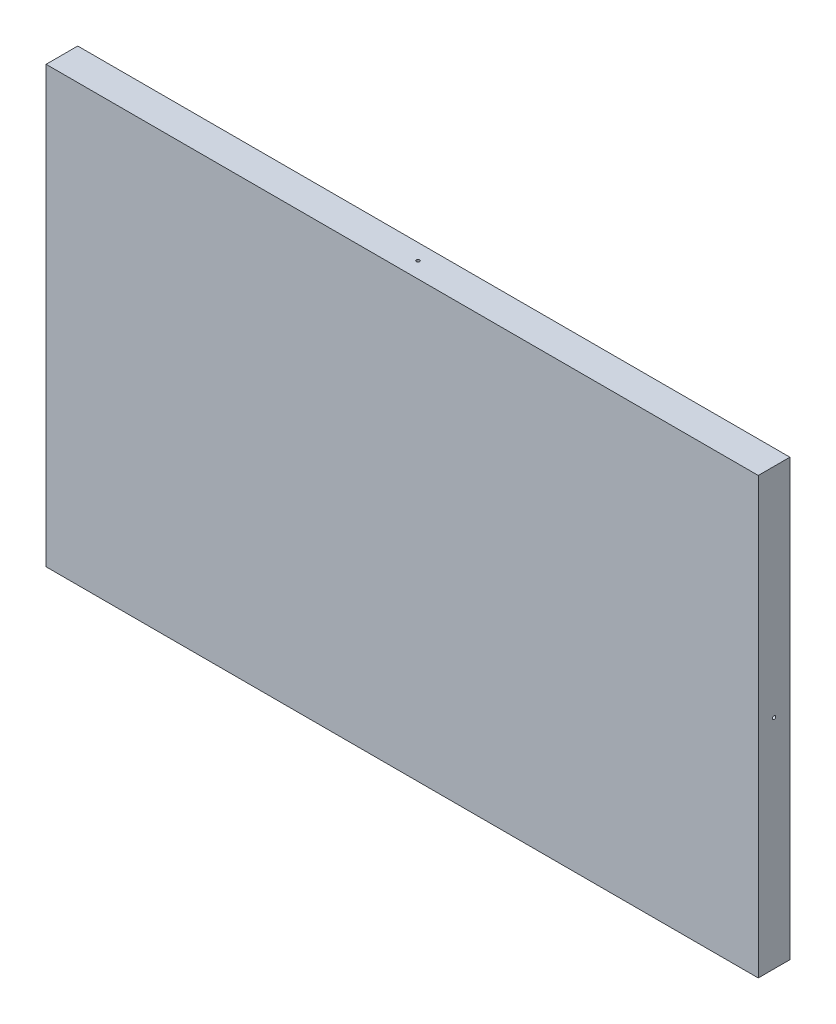
ISO-10303-21;
HEADER;
FILE_DESCRIPTION(('STEP AP214'),'2;1');
FILE_NAME('part.step','',(''),(''),'','','');
FILE_SCHEMA(('AUTOMOTIVE_DESIGN { 1 0 10303 214 1 1 1 1 }'));
ENDSEC;
DATA;
#1=APPLICATION_CONTEXT('core data for automotive mechanical design processes');
#2=APPLICATION_PROTOCOL_DEFINITION('international standard','automotive_design',2000,#1);
#3=PRODUCT_CONTEXT('',#1,'mechanical');
#4=PRODUCT('Part','Part','',(#3));
#5=PRODUCT_RELATED_PRODUCT_CATEGORY('part','',(#4));
#6=PRODUCT_DEFINITION_FORMATION('','',#4);
#7=PRODUCT_DEFINITION_CONTEXT('part definition',#1,'design');
#8=PRODUCT_DEFINITION('design','',#6,#7);
#9=PRODUCT_DEFINITION_SHAPE('','',#8);
#10=(LENGTH_UNIT() NAMED_UNIT(*) SI_UNIT(.MILLI.,.METRE.));
#11=(NAMED_UNIT(*) PLANE_ANGLE_UNIT() SI_UNIT($,.RADIAN.));
#12=(NAMED_UNIT(*) SI_UNIT($,.STERADIAN.) SOLID_ANGLE_UNIT());
#13=UNCERTAINTY_MEASURE_WITH_UNIT(LENGTH_MEASURE(1.E-05),#10,'distance_accuracy_value','');
#14=(GEOMETRIC_REPRESENTATION_CONTEXT(3) GLOBAL_UNCERTAINTY_ASSIGNED_CONTEXT((#13)) GLOBAL_UNIT_ASSIGNED_CONTEXT((#10,
#11,#12)) REPRESENTATION_CONTEXT('',''));
#15=CARTESIAN_POINT('',(0.,0.,0.));
#16=DIRECTION('',(0.,0.,1.));
#17=DIRECTION('',(1.,0.,0.));
#18=AXIS2_PLACEMENT_3D('',#15,#16,#17);
#19=CARTESIAN_POINT('',(1.11022302462516E-13,275.,20.));
#20=DIRECTION('',(0.,1.,0.));
#21=DIRECTION('',(0.,0.,1.));
#22=AXIS2_PLACEMENT_3D('',#19,#20,#21);
#23=CYLINDRICAL_SURFACE('',#22,2.09999999999996);
#24=CARTESIAN_POINT('',(1.11022302462516E-13,275.,20.));
#25=DIRECTION('',(0.,1.,0.));
#26=DIRECTION('',(0.,0.,1.));
#27=AXIS2_PLACEMENT_3D('',#24,#25,#26);
#28=CIRCLE('',#27,2.09999999999999);
#29=CARTESIAN_POINT('',(1.11022302462516E-13,275.,22.1));
#30=VERTEX_POINT('',#29);
#31=EDGE_CURVE('E136',#30,#30,#28,.T.);
#32=ORIENTED_EDGE('',*,*,#31,.T.);
#33=EDGE_LOOP('',(#32));
#34=FACE_BOUND('',#33,.T.);
#35=CARTESIAN_POINT('',(1.11022302462516E-13,0.,20.));
#36=DIRECTION('',(0.707106781186547,0.707106781186547,0.));
#37=DIRECTION('',(-0.707106781186547,0.707106781186547,0.));
#38=AXIS2_PLACEMENT_3D('',#35,#36,#37);
#39=ELLIPSE('',#38,2.96984848098343,2.09999999999995);
#40=CARTESIAN_POINT('',(1.11022302462516E-13,0.,22.0999999999999));
#41=VERTEX_POINT('',#40);
#42=CARTESIAN_POINT('',(1.11022302462516E-13,0.,17.9000000000001));
#43=VERTEX_POINT('',#42);
#44=EDGE_CURVE('E55',#41,#43,#39,.F.);
#45=ORIENTED_EDGE('',*,*,#44,.T.);
#46=CARTESIAN_POINT('',(1.11022302462516E-13,0.,20.));
#47=DIRECTION('',(-0.707106781186547,0.707106781186547,0.));
#48=DIRECTION('',(0.707106781186547,0.707106781186547,0.));
#49=AXIS2_PLACEMENT_3D('',#46,#47,#48);
#50=ELLIPSE('',#49,2.96984848098343,2.09999999999995);
#51=EDGE_CURVE('E11',#43,#41,#50,.F.);
#52=ORIENTED_EDGE('',*,*,#51,.T.);
#53=EDGE_LOOP('',(#45,#52));
#54=FACE_BOUND('',#53,.T.);
#55=ADVANCED_FACE('F42',(#34,#54),#23,.F.);
#56=CARTESIAN_POINT('',(450.,275.,40.));
#57=DIRECTION('',(-1.,0.,0.));
#58=DIRECTION('',(0.,-1.,0.));
#59=AXIS2_PLACEMENT_3D('',#56,#57,#58);
#60=PLANE('',#59);
#61=CARTESIAN_POINT('',(450.,0.,20.));
#62=DIRECTION('',(-1.,0.,0.));
#63=DIRECTION('',(0.,0.,1.));
#64=AXIS2_PLACEMENT_3D('',#61,#62,#63);
#65=CIRCLE('',#64,2.09999999999989);
#66=CARTESIAN_POINT('',(450.,0.,22.0999999999999));
#67=VERTEX_POINT('',#66);
#68=EDGE_CURVE('E139',#67,#67,#65,.T.);
#69=ORIENTED_EDGE('',*,*,#68,.T.);
#70=EDGE_LOOP('',(#69));
#71=FACE_BOUND('',#70,.T.);
#72=DIRECTION('',(0.,1.,0.));
#73=VECTOR('',#72,1.);
#74=CARTESIAN_POINT('',(450.,275.,0.));
#75=LINE('',#74,#73);
#76=CARTESIAN_POINT('',(450.,-275.,0.));
#77=VERTEX_POINT('',#76);
#78=CARTESIAN_POINT('',(450.,275.,0.));
#79=VERTEX_POINT('',#78);
#80=EDGE_CURVE('E125',#77,#79,#75,.T.);
#81=ORIENTED_EDGE('',*,*,#80,.T.);
#82=DIRECTION('',(0.,0.,-1.));
#83=VECTOR('',#82,1.);
#84=CARTESIAN_POINT('',(450.,275.,40.));
#85=LINE('',#84,#83);
#86=CARTESIAN_POINT('',(450.,275.,40.));
#87=VERTEX_POINT('',#86);
#88=EDGE_CURVE('E106',#87,#79,#85,.T.);
#89=ORIENTED_EDGE('',*,*,#88,.F.);
#90=DIRECTION('',(0.,1.,0.));
#91=VECTOR('',#90,1.);
#92=CARTESIAN_POINT('',(450.,275.,40.));
#93=LINE('',#92,#91);
#94=CARTESIAN_POINT('',(450.,-275.,40.));
#95=VERTEX_POINT('',#94);
#96=EDGE_CURVE('E120',#95,#87,#93,.T.);
#97=ORIENTED_EDGE('',*,*,#96,.F.);
#98=DIRECTION('',(0.,0.,-1.));
#99=VECTOR('',#98,1.);
#100=CARTESIAN_POINT('',(450.,-275.,40.));
#101=LINE('',#100,#99);
#102=EDGE_CURVE('E117',#95,#77,#101,.T.);
#103=ORIENTED_EDGE('',*,*,#102,.T.);
#104=EDGE_LOOP('',(#81,#89,#97,#103));
#105=FACE_BOUND('',#104,.T.);
#106=ADVANCED_FACE('F44',(#71,#105),#60,.F.);
#107=CARTESIAN_POINT('',(-450.,275.,40.));
#108=DIRECTION('',(0.,-1.,0.));
#109=DIRECTION('',(0.,0.,-1.));
#110=AXIS2_PLACEMENT_3D('',#107,#108,#109);
#111=PLANE('',#110);
#112=ORIENTED_EDGE('',*,*,#31,.F.);
#113=EDGE_LOOP('',(#112));
#114=FACE_BOUND('',#113,.T.);
#115=DIRECTION('',(-1.,0.,0.));
#116=VECTOR('',#115,1.);
#117=CARTESIAN_POINT('',(-450.,275.,0.));
#118=LINE('',#117,#116);
#119=CARTESIAN_POINT('',(-450.,275.,0.));
#120=VERTEX_POINT('',#119);
#121=EDGE_CURVE('E123',#79,#120,#118,.T.);
#122=ORIENTED_EDGE('',*,*,#121,.T.);
#123=DIRECTION('',(0.,0.,-1.));
#124=VECTOR('',#123,1.);
#125=CARTESIAN_POINT('',(-450.,275.,40.));
#126=LINE('',#125,#124);
#127=CARTESIAN_POINT('',(-450.,275.,40.));
#128=VERTEX_POINT('',#127);
#129=EDGE_CURVE('E112',#128,#120,#126,.T.);
#130=ORIENTED_EDGE('',*,*,#129,.F.);
#131=DIRECTION('',(-1.,0.,0.));
#132=VECTOR('',#131,1.);
#133=CARTESIAN_POINT('',(-450.,275.,40.));
#134=LINE('',#133,#132);
#135=EDGE_CURVE('E93',#87,#128,#134,.T.);
#136=ORIENTED_EDGE('',*,*,#135,.F.);
#137=ORIENTED_EDGE('',*,*,#88,.T.);
#138=EDGE_LOOP('',(#122,#130,#136,#137));
#139=FACE_BOUND('',#138,.T.);
#140=ADVANCED_FACE('F151',(#114,#139),#111,.F.);
#141=CARTESIAN_POINT('',(-450.,275.,40.));
#142=DIRECTION('',(1.,0.,0.));
#143=DIRECTION('',(0.,1.,0.));
#144=AXIS2_PLACEMENT_3D('',#141,#142,#143);
#145=PLANE('',#144);
#146=CARTESIAN_POINT('',(-450.,0.,20.));
#147=DIRECTION('',(-1.,0.,0.));
#148=DIRECTION('',(0.,0.,1.));
#149=AXIS2_PLACEMENT_3D('',#146,#147,#148);
#150=CIRCLE('',#149,2.09999999999999);
#151=CARTESIAN_POINT('',(-450.,0.,22.1));
#152=VERTEX_POINT('',#151);
#153=EDGE_CURVE('E142',#152,#152,#150,.T.);
#154=ORIENTED_EDGE('',*,*,#153,.F.);
#155=EDGE_LOOP('',(#154));
#156=FACE_BOUND('',#155,.T.);
#157=DIRECTION('',(0.,-1.,0.));
#158=VECTOR('',#157,1.);
#159=CARTESIAN_POINT('',(-450.,275.,0.));
#160=LINE('',#159,#158);
#161=CARTESIAN_POINT('',(-450.,-275.,0.));
#162=VERTEX_POINT('',#161);
#163=EDGE_CURVE('E121',#120,#162,#160,.T.);
#164=ORIENTED_EDGE('',*,*,#163,.T.);
#165=DIRECTION('',(0.,0.,-1.));
#166=VECTOR('',#165,1.);
#167=CARTESIAN_POINT('',(-450.,-275.,40.));
#168=LINE('',#167,#166);
#169=CARTESIAN_POINT('',(-450.,-275.,40.));
#170=VERTEX_POINT('',#169);
#171=EDGE_CURVE('E115',#170,#162,#168,.T.);
#172=ORIENTED_EDGE('',*,*,#171,.F.);
#173=DIRECTION('',(0.,-1.,0.));
#174=VECTOR('',#173,1.);
#175=CARTESIAN_POINT('',(-450.,275.,40.));
#176=LINE('',#175,#174);
#177=EDGE_CURVE('E130',#128,#170,#176,.T.);
#178=ORIENTED_EDGE('',*,*,#177,.F.);
#179=ORIENTED_EDGE('',*,*,#129,.T.);
#180=EDGE_LOOP('',(#164,#172,#178,#179));
#181=FACE_BOUND('',#180,.T.);
#182=ADVANCED_FACE('F147',(#156,#181),#145,.F.);
#183=CARTESIAN_POINT('',(-450.,-275.,40.));
#184=DIRECTION('',(0.,1.,0.));
#185=DIRECTION('',(0.,0.,1.));
#186=AXIS2_PLACEMENT_3D('',#183,#184,#185);
#187=PLANE('',#186);
#188=CARTESIAN_POINT('',(1.11022302462516E-13,-275.,20.));
#189=DIRECTION('',(0.,1.,0.));
#190=DIRECTION('',(0.,0.,1.));
#191=AXIS2_PLACEMENT_3D('',#188,#189,#190);
#192=CIRCLE('',#191,2.09999999999993);
#193=CARTESIAN_POINT('',(1.11022302462516E-13,-275.,22.0999999999999));
#194=VERTEX_POINT('',#193);
#195=EDGE_CURVE('E128',#194,#194,#192,.T.);
#196=ORIENTED_EDGE('',*,*,#195,.T.);
#197=EDGE_LOOP('',(#196));
#198=FACE_BOUND('',#197,.T.);
#199=DIRECTION('',(1.,0.,0.));
#200=VECTOR('',#199,1.);
#201=CARTESIAN_POINT('',(-450.,-275.,0.));
#202=LINE('',#201,#200);
#203=EDGE_CURVE('E85',#162,#77,#202,.T.);
#204=ORIENTED_EDGE('',*,*,#203,.T.);
#205=ORIENTED_EDGE('',*,*,#102,.F.);
#206=DIRECTION('',(1.,0.,0.));
#207=VECTOR('',#206,1.);
#208=CARTESIAN_POINT('',(-450.,-275.,40.));
#209=LINE('',#208,#207);
#210=EDGE_CURVE('E64',#170,#95,#209,.T.);
#211=ORIENTED_EDGE('',*,*,#210,.F.);
#212=ORIENTED_EDGE('',*,*,#171,.T.);
#213=EDGE_LOOP('',(#204,#205,#211,#212));
#214=FACE_BOUND('',#213,.T.);
#215=ADVANCED_FACE('F150',(#198,#214),#187,.F.);
#216=CARTESIAN_POINT('',(0.,0.,40.));
#217=DIRECTION('',(0.,0.,1.));
#218=DIRECTION('',(1.,0.,0.));
#219=AXIS2_PLACEMENT_3D('',#216,#217,#218);
#220=PLANE('',#219);
#221=ORIENTED_EDGE('',*,*,#96,.T.);
#222=ORIENTED_EDGE('',*,*,#135,.T.);
#223=ORIENTED_EDGE('',*,*,#177,.T.);
#224=ORIENTED_EDGE('',*,*,#210,.T.);
#225=EDGE_LOOP('',(#221,#222,#223,#224));
#226=FACE_BOUND('',#225,.T.);
#227=ADVANCED_FACE('F162',(#226),#220,.T.);
#228=CARTESIAN_POINT('',(0.,0.,0.));
#229=DIRECTION('',(0.,0.,1.));
#230=DIRECTION('',(1.,0.,0.));
#231=AXIS2_PLACEMENT_3D('',#228,#229,#230);
#232=PLANE('',#231);
#233=ORIENTED_EDGE('',*,*,#80,.F.);
#234=ORIENTED_EDGE('',*,*,#203,.F.);
#235=ORIENTED_EDGE('',*,*,#163,.F.);
#236=ORIENTED_EDGE('',*,*,#121,.F.);
#237=EDGE_LOOP('',(#233,#234,#235,#236));
#238=FACE_BOUND('',#237,.T.);
#239=ADVANCED_FACE('F158',(#238),#232,.F.);
#240=CARTESIAN_POINT('',(1.11022302462516E-13,0.,20.));
#241=DIRECTION('',(0.707106781186547,0.707106781186547,0.));
#242=DIRECTION('',(-0.707106781186547,0.707106781186547,0.));
#243=AXIS2_PLACEMENT_3D('',#240,#241,#242);
#244=ELLIPSE('',#243,2.96984848098343,2.09999999999995);
#245=EDGE_CURVE('E99',#41,#43,#244,.T.);
#246=ORIENTED_EDGE('',*,*,#245,.T.);
#247=CARTESIAN_POINT('',(1.11022302462516E-13,0.,20.));
#248=DIRECTION('',(-0.707106781186547,0.707106781186547,0.));
#249=DIRECTION('',(0.707106781186547,0.707106781186547,0.));
#250=AXIS2_PLACEMENT_3D('',#247,#248,#249);
#251=ELLIPSE('',#250,2.96984848098343,2.09999999999995);
#252=EDGE_CURVE('E50',#43,#41,#251,.T.);
#253=ORIENTED_EDGE('',*,*,#252,.T.);
#254=EDGE_LOOP('',(#246,#253));
#255=FACE_BOUND('',#254,.T.);
#256=ORIENTED_EDGE('',*,*,#195,.F.);
#257=EDGE_LOOP('',(#256));
#258=FACE_BOUND('',#257,.T.);
#259=ADVANCED_FACE('F108',(#255,#258),#23,.F.);
#260=CARTESIAN_POINT('',(-450.,0.,20.));
#261=DIRECTION('',(-1.,0.,0.));
#262=DIRECTION('',(0.,0.,1.));
#263=AXIS2_PLACEMENT_3D('',#260,#261,#262);
#264=CYLINDRICAL_SURFACE('',#263,2.09999999999994);
#265=ORIENTED_EDGE('',*,*,#153,.T.);
#266=EDGE_LOOP('',(#265));
#267=FACE_BOUND('',#266,.T.);
#268=ORIENTED_EDGE('',*,*,#44,.F.);
#269=ORIENTED_EDGE('',*,*,#252,.F.);
#270=EDGE_LOOP('',(#268,#269));
#271=FACE_BOUND('',#270,.T.);
#272=ADVANCED_FACE('F105',(#267,#271),#264,.F.);
#273=ORIENTED_EDGE('',*,*,#68,.F.);
#274=EDGE_LOOP('',(#273));
#275=FACE_BOUND('',#274,.T.);
#276=ORIENTED_EDGE('',*,*,#245,.F.);
#277=ORIENTED_EDGE('',*,*,#51,.F.);
#278=EDGE_LOOP('',(#276,#277));
#279=FACE_BOUND('',#278,.T.);
#280=ADVANCED_FACE('F100',(#275,#279),#264,.F.);
#281=CLOSED_SHELL('',(#55,#106,#140,#182,#215,#227,#239,#259,#272,#280));
#282=MANIFOLD_SOLID_BREP('B2',#281);
#283=ADVANCED_BREP_SHAPE_REPRESENTATION('',(#18,#282),#14);
#284=SHAPE_DEFINITION_REPRESENTATION(#9,#283);
ENDSEC;
END-ISO-10303-21;
